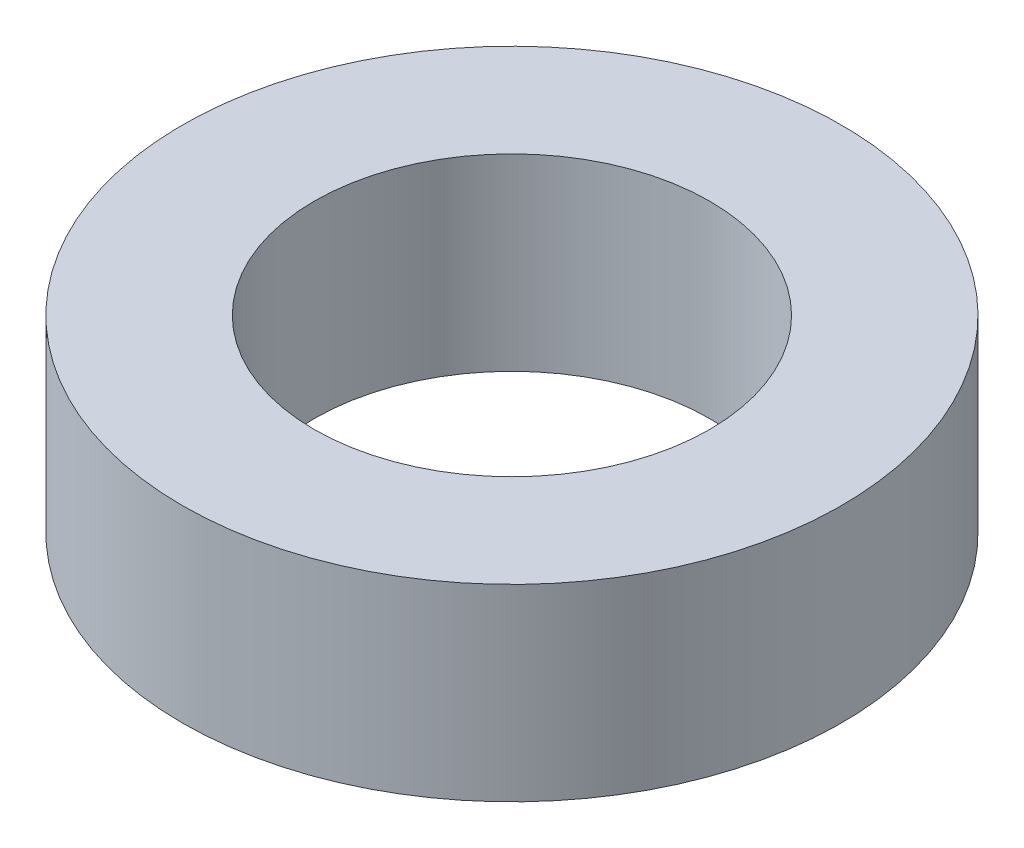
ISO-10303-21;
HEADER;
FILE_DESCRIPTION(('STEP AP214'),'2;1');
FILE_NAME('part.step','',(''),(''),'','','');
FILE_SCHEMA(('AUTOMOTIVE_DESIGN { 1 0 10303 214 1 1 1 1 }'));
ENDSEC;
DATA;
#1=APPLICATION_CONTEXT('core data for automotive mechanical design processes');
#2=APPLICATION_PROTOCOL_DEFINITION('international standard','automotive_design',2000,#1);
#3=PRODUCT_CONTEXT('',#1,'mechanical');
#4=PRODUCT('Part','Part','',(#3));
#5=PRODUCT_RELATED_PRODUCT_CATEGORY('part','',(#4));
#6=PRODUCT_DEFINITION_FORMATION('','',#4);
#7=PRODUCT_DEFINITION_CONTEXT('part definition',#1,'design');
#8=PRODUCT_DEFINITION('design','',#6,#7);
#9=PRODUCT_DEFINITION_SHAPE('','',#8);
#10=(LENGTH_UNIT() NAMED_UNIT(*) SI_UNIT(.MILLI.,.METRE.));
#11=(NAMED_UNIT(*) PLANE_ANGLE_UNIT() SI_UNIT($,.RADIAN.));
#12=(NAMED_UNIT(*) SI_UNIT($,.STERADIAN.) SOLID_ANGLE_UNIT());
#13=UNCERTAINTY_MEASURE_WITH_UNIT(LENGTH_MEASURE(1.E-05),#10,'distance_accuracy_value','');
#14=(GEOMETRIC_REPRESENTATION_CONTEXT(3) GLOBAL_UNCERTAINTY_ASSIGNED_CONTEXT((#13)) GLOBAL_UNIT_ASSIGNED_CONTEXT((#10,
#11,#12)) REPRESENTATION_CONTEXT('',''));
#15=CARTESIAN_POINT('',(0.,0.,0.));
#16=DIRECTION('',(0.,0.,1.));
#17=DIRECTION('',(1.,0.,0.));
#18=AXIS2_PLACEMENT_3D('',#15,#16,#17);
#19=CARTESIAN_POINT('',(0.,2.,0.));
#20=DIRECTION('',(0.,1.,0.));
#21=DIRECTION('',(0.,0.,1.));
#22=AXIS2_PLACEMENT_3D('',#19,#20,#21);
#23=PLANE('',#22);
#24=CARTESIAN_POINT('',(0.,2.,0.));
#25=DIRECTION('',(0.,1.,0.));
#26=DIRECTION('',(0.,0.,1.));
#27=AXIS2_PLACEMENT_3D('',#24,#25,#26);
#28=CIRCLE('',#27,3.5);
#29=CARTESIAN_POINT('',(0.,2.,3.5));
#30=VERTEX_POINT('',#29);
#31=EDGE_CURVE('E10',#30,#30,#28,.T.);
#32=ORIENTED_EDGE('',*,*,#31,.T.);
#33=EDGE_LOOP('',(#32));
#34=FACE_BOUND('',#33,.T.);
#35=CARTESIAN_POINT('',(0.,2.,0.));
#36=DIRECTION('',(0.,1.,0.));
#37=DIRECTION('',(0.,0.,1.));
#38=AXIS2_PLACEMENT_3D('',#35,#36,#37);
#39=CIRCLE('',#38,2.1);
#40=CARTESIAN_POINT('',(0.,2.,2.1));
#41=VERTEX_POINT('',#40);
#42=EDGE_CURVE('E50',#41,#41,#39,.T.);
#43=ORIENTED_EDGE('',*,*,#42,.F.);
#44=EDGE_LOOP('',(#43));
#45=FACE_BOUND('',#44,.T.);
#46=ADVANCED_FACE('F37',(#34,#45),#23,.T.);
#47=CARTESIAN_POINT('',(0.,0.,0.));
#48=DIRECTION('',(0.,1.,0.));
#49=DIRECTION('',(0.,0.,1.));
#50=AXIS2_PLACEMENT_3D('',#47,#48,#49);
#51=PLANE('',#50);
#52=CARTESIAN_POINT('',(0.,0.,0.));
#53=DIRECTION('',(0.,1.,0.));
#54=DIRECTION('',(0.,0.,1.));
#55=AXIS2_PLACEMENT_3D('',#52,#53,#54);
#56=CIRCLE('',#55,3.5);
#57=CARTESIAN_POINT('',(0.,0.,3.5));
#58=VERTEX_POINT('',#57);
#59=EDGE_CURVE('E41',#58,#58,#56,.T.);
#60=ORIENTED_EDGE('',*,*,#59,.F.);
#61=EDGE_LOOP('',(#60));
#62=FACE_BOUND('',#61,.T.);
#63=CARTESIAN_POINT('',(0.,0.,0.));
#64=DIRECTION('',(0.,1.,0.));
#65=DIRECTION('',(0.,0.,1.));
#66=AXIS2_PLACEMENT_3D('',#63,#64,#65);
#67=CIRCLE('',#66,2.1);
#68=CARTESIAN_POINT('',(0.,0.,2.1));
#69=VERTEX_POINT('',#68);
#70=EDGE_CURVE('E52',#69,#69,#67,.T.);
#71=ORIENTED_EDGE('',*,*,#70,.T.);
#72=EDGE_LOOP('',(#71));
#73=FACE_BOUND('',#72,.T.);
#74=ADVANCED_FACE('F64',(#62,#73),#51,.F.);
#75=CARTESIAN_POINT('',(0.,2.,0.));
#76=DIRECTION('',(0.,-1.,0.));
#77=DIRECTION('',(0.,0.,-1.));
#78=AXIS2_PLACEMENT_3D('',#75,#76,#77);
#79=CYLINDRICAL_SURFACE('',#78,3.5);
#80=ORIENTED_EDGE('',*,*,#31,.F.);
#81=EDGE_LOOP('',(#80));
#82=FACE_BOUND('',#81,.T.);
#83=ORIENTED_EDGE('',*,*,#59,.T.);
#84=EDGE_LOOP('',(#83));
#85=FACE_BOUND('',#84,.T.);
#86=ADVANCED_FACE('F39',(#82,#85),#79,.T.);
#87=CARTESIAN_POINT('',(0.,2.,0.));
#88=DIRECTION('',(0.,-1.,0.));
#89=DIRECTION('',(0.,0.,-1.));
#90=AXIS2_PLACEMENT_3D('',#87,#88,#89);
#91=CYLINDRICAL_SURFACE('',#90,2.1);
#92=ORIENTED_EDGE('',*,*,#42,.T.);
#93=EDGE_LOOP('',(#92));
#94=FACE_BOUND('',#93,.T.);
#95=ORIENTED_EDGE('',*,*,#70,.F.);
#96=EDGE_LOOP('',(#95));
#97=FACE_BOUND('',#96,.T.);
#98=ADVANCED_FACE('F60',(#94,#97),#91,.F.);
#99=CLOSED_SHELL('',(#46,#74,#86,#98));
#100=MANIFOLD_SOLID_BREP('B2',#99);
#101=ADVANCED_BREP_SHAPE_REPRESENTATION('',(#18,#100),#14);
#102=SHAPE_DEFINITION_REPRESENTATION(#9,#101);
ENDSEC;
END-ISO-10303-21;
